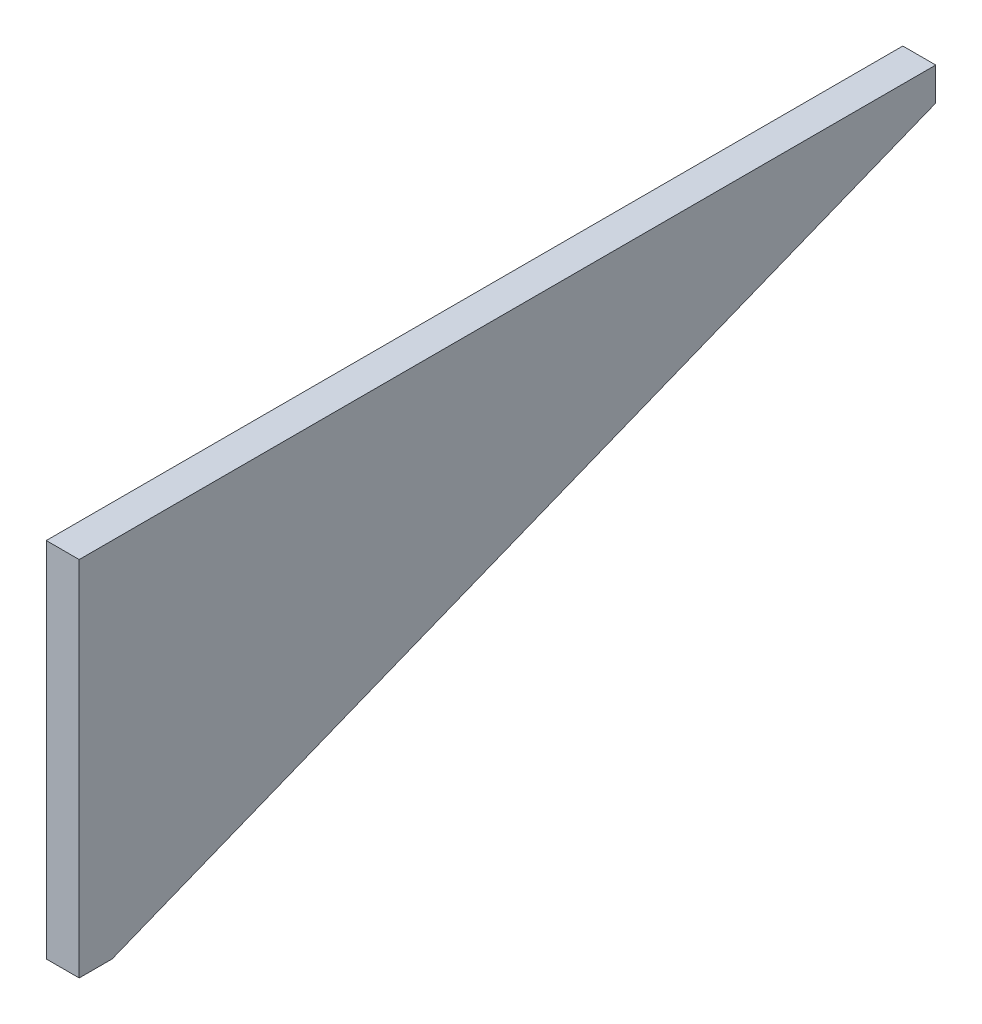
ISO-10303-21;
HEADER;
FILE_DESCRIPTION(('STEP AP214'),'2;1');
FILE_NAME('part.step','',(''),(''),'','','');
FILE_SCHEMA(('AUTOMOTIVE_DESIGN { 1 0 10303 214 1 1 1 1 }'));
ENDSEC;
DATA;
#1=APPLICATION_CONTEXT('core data for automotive mechanical design processes');
#2=APPLICATION_PROTOCOL_DEFINITION('international standard','automotive_design',2000,#1);
#3=PRODUCT_CONTEXT('',#1,'mechanical');
#4=PRODUCT('Part','Part','',(#3));
#5=PRODUCT_RELATED_PRODUCT_CATEGORY('part','',(#4));
#6=PRODUCT_DEFINITION_FORMATION('','',#4);
#7=PRODUCT_DEFINITION_CONTEXT('part definition',#1,'design');
#8=PRODUCT_DEFINITION('design','',#6,#7);
#9=PRODUCT_DEFINITION_SHAPE('','',#8);
#10=(LENGTH_UNIT() NAMED_UNIT(*) SI_UNIT(.MILLI.,.METRE.));
#11=(NAMED_UNIT(*) PLANE_ANGLE_UNIT() SI_UNIT($,.RADIAN.));
#12=(NAMED_UNIT(*) SI_UNIT($,.STERADIAN.) SOLID_ANGLE_UNIT());
#13=UNCERTAINTY_MEASURE_WITH_UNIT(LENGTH_MEASURE(1.E-05),#10,'distance_accuracy_value','');
#14=(GEOMETRIC_REPRESENTATION_CONTEXT(3) GLOBAL_UNCERTAINTY_ASSIGNED_CONTEXT((#13)) GLOBAL_UNIT_ASSIGNED_CONTEXT((#10,
#11,#12)) REPRESENTATION_CONTEXT('',''));
#15=CARTESIAN_POINT('',(0.,0.,0.));
#16=DIRECTION('',(0.,0.,1.));
#17=DIRECTION('',(1.,0.,0.));
#18=AXIS2_PLACEMENT_3D('',#15,#16,#17);
#19=CARTESIAN_POINT('',(2.,-22.,0.));
#20=DIRECTION('',(0.,0.,-1.));
#21=DIRECTION('',(-1.,0.,0.));
#22=AXIS2_PLACEMENT_3D('',#19,#20,#21);
#23=PLANE('',#22);
#24=DIRECTION('',(0.,-1.,0.));
#25=VECTOR('',#24,1.);
#26=CARTESIAN_POINT('',(0.,-22.,0.));
#27=LINE('',#26,#25);
#28=CARTESIAN_POINT('',(0.,0.,0.));
#29=VERTEX_POINT('',#28);
#30=CARTESIAN_POINT('',(0.,-22.,0.));
#31=VERTEX_POINT('',#30);
#32=EDGE_CURVE('E118',#29,#31,#27,.T.);
#33=ORIENTED_EDGE('',*,*,#32,.T.);
#34=DIRECTION('',(-1.,0.,0.));
#35=VECTOR('',#34,1.);
#36=CARTESIAN_POINT('',(2.,-22.,0.));
#37=LINE('',#36,#35);
#38=CARTESIAN_POINT('',(2.,-22.,0.));
#39=VERTEX_POINT('',#38);
#40=EDGE_CURVE('E11',#39,#31,#37,.T.);
#41=ORIENTED_EDGE('',*,*,#40,.F.);
#42=DIRECTION('',(0.,-1.,0.));
#43=VECTOR('',#42,1.);
#44=CARTESIAN_POINT('',(2.,-22.,0.));
#45=LINE('',#44,#43);
#46=CARTESIAN_POINT('',(2.,0.,0.));
#47=VERTEX_POINT('',#46);
#48=EDGE_CURVE('E131',#47,#39,#45,.T.);
#49=ORIENTED_EDGE('',*,*,#48,.F.);
#50=DIRECTION('',(-1.,0.,0.));
#51=VECTOR('',#50,1.);
#52=CARTESIAN_POINT('',(2.,0.,0.));
#53=LINE('',#52,#51);
#54=EDGE_CURVE('E114',#47,#29,#53,.T.);
#55=ORIENTED_EDGE('',*,*,#54,.T.);
#56=EDGE_LOOP('',(#33,#41,#49,#55));
#57=FACE_BOUND('',#56,.T.);
#58=ADVANCED_FACE('F39',(#57),#23,.F.);
#59=CARTESIAN_POINT('',(2.,-22.,-2.));
#60=DIRECTION('',(0.,1.,0.));
#61=DIRECTION('',(0.,0.,1.));
#62=AXIS2_PLACEMENT_3D('',#59,#60,#61);
#63=PLANE('',#62);
#64=DIRECTION('',(0.,0.,-1.));
#65=VECTOR('',#64,1.);
#66=CARTESIAN_POINT('',(0.,-22.,-2.));
#67=LINE('',#66,#65);
#68=CARTESIAN_POINT('',(0.,-22.,-2.));
#69=VERTEX_POINT('',#68);
#70=EDGE_CURVE('E122',#31,#69,#67,.T.);
#71=ORIENTED_EDGE('',*,*,#70,.T.);
#72=DIRECTION('',(-1.,0.,0.));
#73=VECTOR('',#72,1.);
#74=CARTESIAN_POINT('',(2.,-22.,-2.));
#75=LINE('',#74,#73);
#76=CARTESIAN_POINT('',(2.,-22.,-2.));
#77=VERTEX_POINT('',#76);
#78=EDGE_CURVE('E48',#77,#69,#75,.T.);
#79=ORIENTED_EDGE('',*,*,#78,.F.);
#80=DIRECTION('',(0.,0.,-1.));
#81=VECTOR('',#80,1.);
#82=CARTESIAN_POINT('',(2.,-22.,-2.));
#83=LINE('',#82,#81);
#84=EDGE_CURVE('E90',#39,#77,#83,.T.);
#85=ORIENTED_EDGE('',*,*,#84,.F.);
#86=ORIENTED_EDGE('',*,*,#40,.T.);
#87=EDGE_LOOP('',(#71,#79,#85,#86));
#88=FACE_BOUND('',#87,.T.);
#89=ADVANCED_FACE('F153',(#88),#63,.F.);
#90=CARTESIAN_POINT('',(2.,-2.,-52.));
#91=DIRECTION('',(0.,0.928476690885259,0.371390676354104));
#92=DIRECTION('',(0.,-0.371390676354104,0.92847669088526));
#93=AXIS2_PLACEMENT_3D('',#90,#91,#92);
#94=PLANE('',#93);
#95=DIRECTION('',(0.,0.371390676354104,-0.928476690885259));
#96=VECTOR('',#95,1.);
#97=CARTESIAN_POINT('',(0.,-2.,-52.));
#98=LINE('',#97,#96);
#99=CARTESIAN_POINT('',(0.,-2.,-52.));
#100=VERTEX_POINT('',#99);
#101=EDGE_CURVE('E106',#69,#100,#98,.T.);
#102=ORIENTED_EDGE('',*,*,#101,.T.);
#103=DIRECTION('',(-1.,0.,0.));
#104=VECTOR('',#103,1.);
#105=CARTESIAN_POINT('',(2.,-2.,-52.));
#106=LINE('',#105,#104);
#107=CARTESIAN_POINT('',(2.,-2.,-52.));
#108=VERTEX_POINT('',#107);
#109=EDGE_CURVE('E103',#108,#100,#106,.T.);
#110=ORIENTED_EDGE('',*,*,#109,.F.);
#111=DIRECTION('',(0.,0.371390676354104,-0.928476690885259));
#112=VECTOR('',#111,1.);
#113=CARTESIAN_POINT('',(2.,-2.,-52.));
#114=LINE('',#113,#112);
#115=EDGE_CURVE('E94',#77,#108,#114,.T.);
#116=ORIENTED_EDGE('',*,*,#115,.F.);
#117=ORIENTED_EDGE('',*,*,#78,.T.);
#118=EDGE_LOOP('',(#102,#110,#116,#117));
#119=FACE_BOUND('',#118,.T.);
#120=ADVANCED_FACE('F104',(#119),#94,.F.);
#121=CARTESIAN_POINT('',(2.,0.,-52.));
#122=DIRECTION('',(0.,0.,1.));
#123=DIRECTION('',(1.,0.,0.));
#124=AXIS2_PLACEMENT_3D('',#121,#122,#123);
#125=PLANE('',#124);
#126=DIRECTION('',(0.,1.,0.));
#127=VECTOR('',#126,1.);
#128=CARTESIAN_POINT('',(0.,0.,-52.));
#129=LINE('',#128,#127);
#130=CARTESIAN_POINT('',(0.,0.,-52.));
#131=VERTEX_POINT('',#130);
#132=EDGE_CURVE('E76',#100,#131,#129,.T.);
#133=ORIENTED_EDGE('',*,*,#132,.T.);
#134=DIRECTION('',(-1.,0.,0.));
#135=VECTOR('',#134,1.);
#136=CARTESIAN_POINT('',(2.,0.,-52.));
#137=LINE('',#136,#135);
#138=CARTESIAN_POINT('',(2.,0.,-52.));
#139=VERTEX_POINT('',#138);
#140=EDGE_CURVE('E108',#139,#131,#137,.T.);
#141=ORIENTED_EDGE('',*,*,#140,.F.);
#142=DIRECTION('',(0.,1.,0.));
#143=VECTOR('',#142,1.);
#144=CARTESIAN_POINT('',(2.,0.,-52.));
#145=LINE('',#144,#143);
#146=EDGE_CURVE('E98',#108,#139,#145,.T.);
#147=ORIENTED_EDGE('',*,*,#146,.F.);
#148=ORIENTED_EDGE('',*,*,#109,.T.);
#149=EDGE_LOOP('',(#133,#141,#147,#148));
#150=FACE_BOUND('',#149,.T.);
#151=ADVANCED_FACE('F110',(#150),#125,.F.);
#152=CARTESIAN_POINT('',(2.,0.,0.));
#153=DIRECTION('',(0.,-1.,0.));
#154=DIRECTION('',(0.,0.,-1.));
#155=AXIS2_PLACEMENT_3D('',#152,#153,#154);
#156=PLANE('',#155);
#157=DIRECTION('',(0.,0.,1.));
#158=VECTOR('',#157,1.);
#159=CARTESIAN_POINT('',(0.,0.,0.));
#160=LINE('',#159,#158);
#161=EDGE_CURVE('E82',#131,#29,#160,.T.);
#162=ORIENTED_EDGE('',*,*,#161,.T.);
#163=ORIENTED_EDGE('',*,*,#54,.F.);
#164=DIRECTION('',(0.,0.,1.));
#165=VECTOR('',#164,1.);
#166=CARTESIAN_POINT('',(2.,0.,0.));
#167=LINE('',#166,#165);
#168=EDGE_CURVE('E56',#139,#47,#167,.T.);
#169=ORIENTED_EDGE('',*,*,#168,.F.);
#170=ORIENTED_EDGE('',*,*,#140,.T.);
#171=EDGE_LOOP('',(#162,#163,#169,#170));
#172=FACE_BOUND('',#171,.T.);
#173=ADVANCED_FACE('F142',(#172),#156,.F.);
#174=CARTESIAN_POINT('',(2.,0.,0.));
#175=DIRECTION('',(-1.,0.,0.));
#176=DIRECTION('',(0.,0.,1.));
#177=AXIS2_PLACEMENT_3D('',#174,#175,#176);
#178=PLANE('',#177);
#179=ORIENTED_EDGE('',*,*,#48,.T.);
#180=ORIENTED_EDGE('',*,*,#84,.T.);
#181=ORIENTED_EDGE('',*,*,#115,.T.);
#182=ORIENTED_EDGE('',*,*,#146,.T.);
#183=ORIENTED_EDGE('',*,*,#168,.T.);
#184=EDGE_LOOP('',(#179,#180,#181,#182,#183));
#185=FACE_BOUND('',#184,.T.);
#186=ADVANCED_FACE('F96',(#185),#178,.F.);
#187=CARTESIAN_POINT('',(0.,0.,0.));
#188=DIRECTION('',(-1.,0.,0.));
#189=DIRECTION('',(0.,0.,1.));
#190=AXIS2_PLACEMENT_3D('',#187,#188,#189);
#191=PLANE('',#190);
#192=ORIENTED_EDGE('',*,*,#32,.F.);
#193=ORIENTED_EDGE('',*,*,#161,.F.);
#194=ORIENTED_EDGE('',*,*,#132,.F.);
#195=ORIENTED_EDGE('',*,*,#101,.F.);
#196=ORIENTED_EDGE('',*,*,#70,.F.);
#197=EDGE_LOOP('',(#192,#193,#194,#195,#196));
#198=FACE_BOUND('',#197,.T.);
#199=ADVANCED_FACE('F138',(#198),#191,.T.);
#200=CLOSED_SHELL('',(#58,#89,#120,#151,#173,#186,#199));
#201=MANIFOLD_SOLID_BREP('B2',#200);
#202=ADVANCED_BREP_SHAPE_REPRESENTATION('',(#18,#201),#14);
#203=SHAPE_DEFINITION_REPRESENTATION(#9,#202);
ENDSEC;
END-ISO-10303-21;
